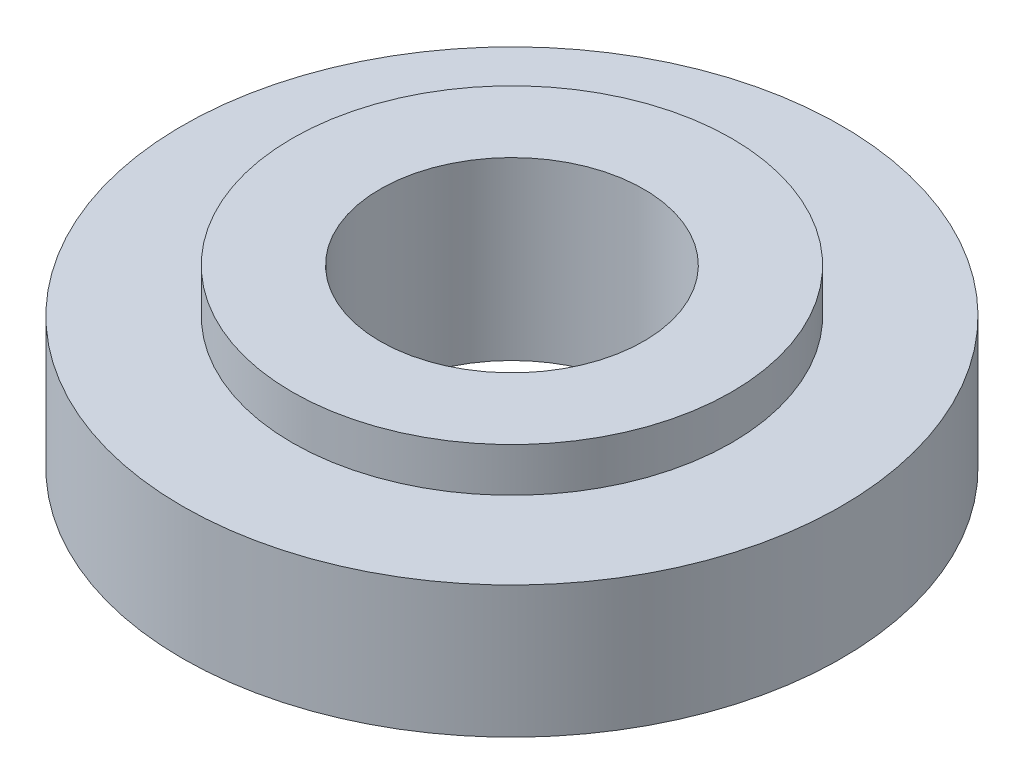
ISO-10303-21;
HEADER;
FILE_DESCRIPTION(('STEP AP214'),'2;1');
FILE_NAME('part.step','',(''),(''),'','','');
FILE_SCHEMA(('AUTOMOTIVE_DESIGN { 1 0 10303 214 1 1 1 1 }'));
ENDSEC;
DATA;
#1=APPLICATION_CONTEXT('core data for automotive mechanical design processes');
#2=APPLICATION_PROTOCOL_DEFINITION('international standard','automotive_design',2000,#1);
#3=PRODUCT_CONTEXT('',#1,'mechanical');
#4=PRODUCT('Part','Part','',(#3));
#5=PRODUCT_RELATED_PRODUCT_CATEGORY('part','',(#4));
#6=PRODUCT_DEFINITION_FORMATION('','',#4);
#7=PRODUCT_DEFINITION_CONTEXT('part definition',#1,'design');
#8=PRODUCT_DEFINITION('design','',#6,#7);
#9=PRODUCT_DEFINITION_SHAPE('','',#8);
#10=(LENGTH_UNIT() NAMED_UNIT(*) SI_UNIT(.MILLI.,.METRE.));
#11=(NAMED_UNIT(*) PLANE_ANGLE_UNIT() SI_UNIT($,.RADIAN.));
#12=(NAMED_UNIT(*) SI_UNIT($,.STERADIAN.) SOLID_ANGLE_UNIT());
#13=UNCERTAINTY_MEASURE_WITH_UNIT(LENGTH_MEASURE(1.E-05),#10,'distance_accuracy_value','');
#14=(GEOMETRIC_REPRESENTATION_CONTEXT(3) GLOBAL_UNCERTAINTY_ASSIGNED_CONTEXT((#13)) GLOBAL_UNIT_ASSIGNED_CONTEXT((#10,
#11,#12)) REPRESENTATION_CONTEXT('',''));
#15=CARTESIAN_POINT('',(0.,0.,0.));
#16=DIRECTION('',(0.,0.,1.));
#17=DIRECTION('',(1.,0.,0.));
#18=AXIS2_PLACEMENT_3D('',#15,#16,#17);
#19=CARTESIAN_POINT('',(0.,0.,0.));
#20=DIRECTION('',(0.,1.,0.));
#21=DIRECTION('',(0.,0.,1.));
#22=AXIS2_PLACEMENT_3D('',#19,#20,#21);
#23=PLANE('',#22);
#24=CARTESIAN_POINT('',(0.,0.,0.));
#25=DIRECTION('',(0.,1.,0.));
#26=DIRECTION('',(0.,0.,1.));
#27=AXIS2_PLACEMENT_3D('',#24,#25,#26);
#28=CIRCLE('',#27,3.75);
#29=CARTESIAN_POINT('',(0.,0.,3.75));
#30=VERTEX_POINT('',#29);
#31=EDGE_CURVE('E38',#30,#30,#28,.T.);
#32=ORIENTED_EDGE('',*,*,#31,.T.);
#33=EDGE_LOOP('',(#32));
#34=FACE_BOUND('',#33,.T.);
#35=CARTESIAN_POINT('',(0.,0.,0.));
#36=DIRECTION('',(0.,1.,0.));
#37=DIRECTION('',(0.,0.,1.));
#38=AXIS2_PLACEMENT_3D('',#35,#36,#37);
#39=CIRCLE('',#38,2.5);
#40=CARTESIAN_POINT('',(0.,0.,2.5));
#41=VERTEX_POINT('',#40);
#42=EDGE_CURVE('E48',#41,#41,#39,.T.);
#43=ORIENTED_EDGE('',*,*,#42,.F.);
#44=EDGE_LOOP('',(#43));
#45=FACE_BOUND('',#44,.T.);
#46=ADVANCED_FACE('F34',(#34,#45),#23,.T.);
#47=CARTESIAN_POINT('',(0.,-1.5,0.));
#48=DIRECTION('',(0.,1.,0.));
#49=DIRECTION('',(0.,0.,1.));
#50=AXIS2_PLACEMENT_3D('',#47,#48,#49);
#51=CYLINDRICAL_SURFACE('',#50,3.75);
#52=CARTESIAN_POINT('',(0.,-1.5,0.));
#53=DIRECTION('',(0.,1.,0.));
#54=DIRECTION('',(0.,0.,1.));
#55=AXIS2_PLACEMENT_3D('',#52,#53,#54);
#56=CIRCLE('',#55,3.75);
#57=CARTESIAN_POINT('',(0.,-1.5,3.75));
#58=VERTEX_POINT('',#57);
#59=EDGE_CURVE('E42',#58,#58,#56,.T.);
#60=ORIENTED_EDGE('',*,*,#59,.T.);
#61=EDGE_LOOP('',(#60));
#62=FACE_BOUND('',#61,.T.);
#63=ORIENTED_EDGE('',*,*,#31,.F.);
#64=EDGE_LOOP('',(#63));
#65=FACE_BOUND('',#64,.T.);
#66=ADVANCED_FACE('F36',(#62,#65),#51,.T.);
#67=CARTESIAN_POINT('',(0.,-1.5,0.));
#68=DIRECTION('',(0.,1.,0.));
#69=DIRECTION('',(0.,0.,1.));
#70=AXIS2_PLACEMENT_3D('',#67,#68,#69);
#71=CYLINDRICAL_SURFACE('',#70,1.5);
#72=CARTESIAN_POINT('',(0.,-1.5,0.));
#73=DIRECTION('',(0.,1.,0.));
#74=DIRECTION('',(0.,0.,1.));
#75=AXIS2_PLACEMENT_3D('',#72,#73,#74);
#76=CIRCLE('',#75,1.5);
#77=CARTESIAN_POINT('',(0.,-1.5,1.5));
#78=VERTEX_POINT('',#77);
#79=EDGE_CURVE('E10',#78,#78,#76,.T.);
#80=ORIENTED_EDGE('',*,*,#79,.F.);
#81=EDGE_LOOP('',(#80));
#82=FACE_BOUND('',#81,.T.);
#83=CARTESIAN_POINT('',(0.,0.5,0.));
#84=DIRECTION('',(0.,1.,0.));
#85=DIRECTION('',(0.,0.,1.));
#86=AXIS2_PLACEMENT_3D('',#83,#84,#85);
#87=CIRCLE('',#86,1.5);
#88=CARTESIAN_POINT('',(0.,0.5,1.5));
#89=VERTEX_POINT('',#88);
#90=EDGE_CURVE('E51',#89,#89,#87,.T.);
#91=ORIENTED_EDGE('',*,*,#90,.T.);
#92=EDGE_LOOP('',(#91));
#93=FACE_BOUND('',#92,.T.);
#94=ADVANCED_FACE('F58',(#82,#93),#71,.F.);
#95=CARTESIAN_POINT('',(0.,-1.5,0.));
#96=DIRECTION('',(0.,1.,0.));
#97=DIRECTION('',(0.,0.,1.));
#98=AXIS2_PLACEMENT_3D('',#95,#96,#97);
#99=PLANE('',#98);
#100=ORIENTED_EDGE('',*,*,#59,.F.);
#101=EDGE_LOOP('',(#100));
#102=FACE_BOUND('',#101,.T.);
#103=ORIENTED_EDGE('',*,*,#79,.T.);
#104=EDGE_LOOP('',(#103));
#105=FACE_BOUND('',#104,.T.);
#106=ADVANCED_FACE('F69',(#102,#105),#99,.F.);
#107=CARTESIAN_POINT('',(0.,0.5,0.));
#108=DIRECTION('',(0.,-1.,0.));
#109=DIRECTION('',(0.,0.,-1.));
#110=AXIS2_PLACEMENT_3D('',#107,#108,#109);
#111=CYLINDRICAL_SURFACE('',#110,2.5);
#112=CARTESIAN_POINT('',(0.,0.5,0.));
#113=DIRECTION('',(0.,1.,0.));
#114=DIRECTION('',(0.,0.,1.));
#115=AXIS2_PLACEMENT_3D('',#112,#113,#114);
#116=CIRCLE('',#115,2.5);
#117=CARTESIAN_POINT('',(0.,0.5,2.5));
#118=VERTEX_POINT('',#117);
#119=EDGE_CURVE('E52',#118,#118,#116,.T.);
#120=ORIENTED_EDGE('',*,*,#119,.F.);
#121=EDGE_LOOP('',(#120));
#122=FACE_BOUND('',#121,.T.);
#123=ORIENTED_EDGE('',*,*,#42,.T.);
#124=EDGE_LOOP('',(#123));
#125=FACE_BOUND('',#124,.T.);
#126=ADVANCED_FACE('F63',(#122,#125),#111,.T.);
#127=CARTESIAN_POINT('',(0.,0.5,0.));
#128=DIRECTION('',(0.,1.,0.));
#129=DIRECTION('',(0.,0.,1.));
#130=AXIS2_PLACEMENT_3D('',#127,#128,#129);
#131=PLANE('',#130);
#132=ORIENTED_EDGE('',*,*,#90,.F.);
#133=EDGE_LOOP('',(#132));
#134=FACE_BOUND('',#133,.T.);
#135=ORIENTED_EDGE('',*,*,#119,.T.);
#136=EDGE_LOOP('',(#135));
#137=FACE_BOUND('',#136,.T.);
#138=ADVANCED_FACE('F60',(#134,#137),#131,.T.);
#139=CLOSED_SHELL('',(#46,#66,#94,#106,#126,#138));
#140=MANIFOLD_SOLID_BREP('B2',#139);
#141=ADVANCED_BREP_SHAPE_REPRESENTATION('',(#18,#140),#14);
#142=SHAPE_DEFINITION_REPRESENTATION(#9,#141);
ENDSEC;
END-ISO-10303-21;
